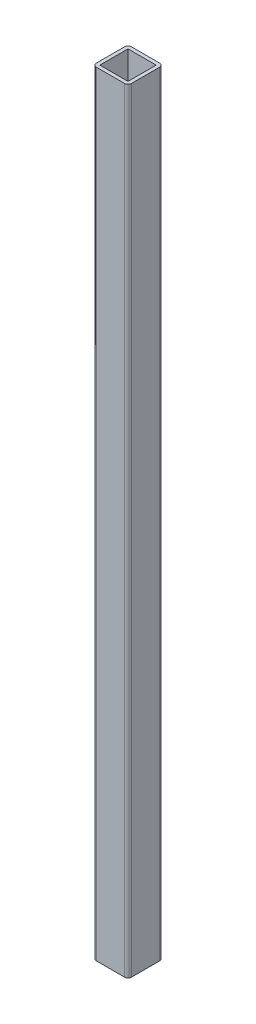
ISO-10303-21;
HEADER;
FILE_DESCRIPTION(('STEP AP214'),'2;1');
FILE_NAME('part.step','',(''),(''),'','','');
FILE_SCHEMA(('AUTOMOTIVE_DESIGN { 1 0 10303 214 1 1 1 1 }'));
ENDSEC;
DATA;
#1=APPLICATION_CONTEXT('core data for automotive mechanical design processes');
#2=APPLICATION_PROTOCOL_DEFINITION('international standard','automotive_design',2000,#1);
#3=PRODUCT_CONTEXT('',#1,'mechanical');
#4=PRODUCT('Part','Part','',(#3));
#5=PRODUCT_RELATED_PRODUCT_CATEGORY('part','',(#4));
#6=PRODUCT_DEFINITION_FORMATION('','',#4);
#7=PRODUCT_DEFINITION_CONTEXT('part definition',#1,'design');
#8=PRODUCT_DEFINITION('design','',#6,#7);
#9=PRODUCT_DEFINITION_SHAPE('','',#8);
#10=(LENGTH_UNIT() NAMED_UNIT(*) SI_UNIT(.MILLI.,.METRE.));
#11=(NAMED_UNIT(*) PLANE_ANGLE_UNIT() SI_UNIT($,.RADIAN.));
#12=(NAMED_UNIT(*) SI_UNIT($,.STERADIAN.) SOLID_ANGLE_UNIT());
#13=UNCERTAINTY_MEASURE_WITH_UNIT(LENGTH_MEASURE(1.E-05),#10,'distance_accuracy_value','');
#14=(GEOMETRIC_REPRESENTATION_CONTEXT(3) GLOBAL_UNCERTAINTY_ASSIGNED_CONTEXT((#13)) GLOBAL_UNIT_ASSIGNED_CONTEXT((#10,
#11,#12)) REPRESENTATION_CONTEXT('',''));
#15=CARTESIAN_POINT('',(0.,0.,0.));
#16=DIRECTION('',(0.,0.,1.));
#17=DIRECTION('',(1.,0.,0.));
#18=AXIS2_PLACEMENT_3D('',#15,#16,#17);
#19=CARTESIAN_POINT('',(12.7,558.8,-12.7));
#20=DIRECTION('',(0.,0.,1.));
#21=DIRECTION('',(1.,0.,0.));
#22=AXIS2_PLACEMENT_3D('',#19,#20,#21);
#23=PLANE('',#22);
#24=DIRECTION('',(-1.,0.,0.));
#25=VECTOR('',#24,1.);
#26=CARTESIAN_POINT('',(12.7,558.8,-12.7));
#27=LINE('',#26,#25);
#28=CARTESIAN_POINT('',(10.16,558.8,-12.7));
#29=VERTEX_POINT('',#28);
#30=CARTESIAN_POINT('',(-10.16,558.8,-12.7));
#31=VERTEX_POINT('',#30);
#32=EDGE_CURVE('E179',#29,#31,#27,.T.);
#33=ORIENTED_EDGE('',*,*,#32,.F.);
#34=DIRECTION('',(0.,-1.,0.));
#35=VECTOR('',#34,1.);
#36=CARTESIAN_POINT('',(10.16,0.,-12.7));
#37=LINE('',#36,#35);
#38=CARTESIAN_POINT('',(10.16,0.,-12.7));
#39=VERTEX_POINT('',#38);
#40=EDGE_CURVE('E11',#29,#39,#37,.T.);
#41=ORIENTED_EDGE('',*,*,#40,.T.);
#42=DIRECTION('',(-1.,0.,0.));
#43=VECTOR('',#42,1.);
#44=CARTESIAN_POINT('',(12.7,0.,-12.7));
#45=LINE('',#44,#43);
#46=CARTESIAN_POINT('',(-10.16,0.,-12.7));
#47=VERTEX_POINT('',#46);
#48=EDGE_CURVE('E196',#39,#47,#45,.T.);
#49=ORIENTED_EDGE('',*,*,#48,.T.);
#50=DIRECTION('',(0.,-1.,0.));
#51=VECTOR('',#50,1.);
#52=CARTESIAN_POINT('',(-10.16,558.8,-12.7));
#53=LINE('',#52,#51);
#54=EDGE_CURVE('E48',#47,#31,#53,.F.);
#55=ORIENTED_EDGE('',*,*,#54,.T.);
#56=EDGE_LOOP('',(#33,#41,#49,#55));
#57=FACE_BOUND('',#56,.T.);
#58=ADVANCED_FACE('F39',(#57),#23,.F.);
#59=CARTESIAN_POINT('',(-12.7,558.8,-12.7));
#60=DIRECTION('',(1.,0.,0.));
#61=DIRECTION('',(0.,0.,-1.));
#62=AXIS2_PLACEMENT_3D('',#59,#60,#61);
#63=PLANE('',#62);
#64=DIRECTION('',(0.,0.,1.));
#65=VECTOR('',#64,1.);
#66=CARTESIAN_POINT('',(-12.7,0.,-12.7));
#67=LINE('',#66,#65);
#68=CARTESIAN_POINT('',(-12.7,0.,-10.16));
#69=VERTEX_POINT('',#68);
#70=CARTESIAN_POINT('',(-12.7,0.,10.16));
#71=VERTEX_POINT('',#70);
#72=EDGE_CURVE('E200',#69,#71,#67,.T.);
#73=ORIENTED_EDGE('',*,*,#72,.T.);
#74=DIRECTION('',(0.,-1.,0.));
#75=VECTOR('',#74,1.);
#76=CARTESIAN_POINT('',(-12.7,558.8,10.16));
#77=LINE('',#76,#75);
#78=CARTESIAN_POINT('',(-12.7,558.8,10.16));
#79=VERTEX_POINT('',#78);
#80=EDGE_CURVE('E233',#71,#79,#77,.F.);
#81=ORIENTED_EDGE('',*,*,#80,.T.);
#82=DIRECTION('',(0.,0.,1.));
#83=VECTOR('',#82,1.);
#84=CARTESIAN_POINT('',(-12.7,558.8,-12.7));
#85=LINE('',#84,#83);
#86=CARTESIAN_POINT('',(-12.7,558.8,-10.16));
#87=VERTEX_POINT('',#86);
#88=EDGE_CURVE('E183',#87,#79,#85,.T.);
#89=ORIENTED_EDGE('',*,*,#88,.F.);
#90=DIRECTION('',(0.,-1.,0.));
#91=VECTOR('',#90,1.);
#92=CARTESIAN_POINT('',(-12.7,558.8,-10.16));
#93=LINE('',#92,#91);
#94=EDGE_CURVE('E229',#87,#69,#93,.T.);
#95=ORIENTED_EDGE('',*,*,#94,.T.);
#96=EDGE_LOOP('',(#73,#81,#89,#95));
#97=FACE_BOUND('',#96,.T.);
#98=ADVANCED_FACE('F266',(#97),#63,.F.);
#99=CARTESIAN_POINT('',(12.7,558.8,12.7));
#100=DIRECTION('',(0.,0.,1.));
#101=DIRECTION('',(1.,0.,0.));
#102=AXIS2_PLACEMENT_3D('',#99,#100,#101);
#103=PLANE('',#102);
#104=DIRECTION('',(-1.,0.,0.));
#105=VECTOR('',#104,1.);
#106=CARTESIAN_POINT('',(12.7,558.8,12.7));
#107=LINE('',#106,#105);
#108=CARTESIAN_POINT('',(10.16,558.8,12.7));
#109=VERTEX_POINT('',#108);
#110=CARTESIAN_POINT('',(-10.16,558.8,12.7));
#111=VERTEX_POINT('',#110);
#112=EDGE_CURVE('E188',#109,#111,#107,.T.);
#113=ORIENTED_EDGE('',*,*,#112,.T.);
#114=DIRECTION('',(0.,-1.,0.));
#115=VECTOR('',#114,1.);
#116=CARTESIAN_POINT('',(-10.16,0.,12.7));
#117=LINE('',#116,#115);
#118=CARTESIAN_POINT('',(-10.16,0.,12.7));
#119=VERTEX_POINT('',#118);
#120=EDGE_CURVE('E213',#111,#119,#117,.T.);
#121=ORIENTED_EDGE('',*,*,#120,.T.);
#122=DIRECTION('',(-1.,0.,0.));
#123=VECTOR('',#122,1.);
#124=CARTESIAN_POINT('',(12.7,0.,12.7));
#125=LINE('',#124,#123);
#126=CARTESIAN_POINT('',(10.16,0.,12.7));
#127=VERTEX_POINT('',#126);
#128=EDGE_CURVE('E204',#127,#119,#125,.T.);
#129=ORIENTED_EDGE('',*,*,#128,.F.);
#130=DIRECTION('',(0.,-1.,0.));
#131=VECTOR('',#130,1.);
#132=CARTESIAN_POINT('',(10.16,558.8,12.7));
#133=LINE('',#132,#131);
#134=EDGE_CURVE('E195',#127,#109,#133,.F.);
#135=ORIENTED_EDGE('',*,*,#134,.T.);
#136=EDGE_LOOP('',(#113,#121,#129,#135));
#137=FACE_BOUND('',#136,.T.);
#138=ADVANCED_FACE('F274',(#137),#103,.T.);
#139=CARTESIAN_POINT('',(12.7,558.8,-12.7));
#140=DIRECTION('',(1.,0.,0.));
#141=DIRECTION('',(0.,0.,-1.));
#142=AXIS2_PLACEMENT_3D('',#139,#140,#141);
#143=PLANE('',#142);
#144=DIRECTION('',(0.,0.,1.));
#145=VECTOR('',#144,1.);
#146=CARTESIAN_POINT('',(12.7,558.8,-12.7));
#147=LINE('',#146,#145);
#148=CARTESIAN_POINT('',(12.7,558.8,-10.16));
#149=VERTEX_POINT('',#148);
#150=CARTESIAN_POINT('',(12.7,558.8,10.16));
#151=VERTEX_POINT('',#150);
#152=EDGE_CURVE('E192',#149,#151,#147,.T.);
#153=ORIENTED_EDGE('',*,*,#152,.T.);
#154=DIRECTION('',(0.,-1.,0.));
#155=VECTOR('',#154,1.);
#156=CARTESIAN_POINT('',(12.7,558.8,10.16));
#157=LINE('',#156,#155);
#158=CARTESIAN_POINT('',(12.7,0.,10.16));
#159=VERTEX_POINT('',#158);
#160=EDGE_CURVE('E249',#151,#159,#157,.T.);
#161=ORIENTED_EDGE('',*,*,#160,.T.);
#162=DIRECTION('',(0.,0.,1.));
#163=VECTOR('',#162,1.);
#164=CARTESIAN_POINT('',(12.7,0.,-12.7));
#165=LINE('',#164,#163);
#166=CARTESIAN_POINT('',(12.7,0.,-10.16));
#167=VERTEX_POINT('',#166);
#168=EDGE_CURVE('E184',#167,#159,#165,.T.);
#169=ORIENTED_EDGE('',*,*,#168,.F.);
#170=DIRECTION('',(0.,-1.,0.));
#171=VECTOR('',#170,1.);
#172=CARTESIAN_POINT('',(12.7,558.8,-10.16));
#173=LINE('',#172,#171);
#174=EDGE_CURVE('E62',#167,#149,#173,.F.);
#175=ORIENTED_EDGE('',*,*,#174,.T.);
#176=EDGE_LOOP('',(#153,#161,#169,#175));
#177=FACE_BOUND('',#176,.T.);
#178=ADVANCED_FACE('F279',(#177),#143,.T.);
#179=CARTESIAN_POINT('',(0.,558.8,0.));
#180=DIRECTION('',(0.,1.,0.));
#181=DIRECTION('',(0.,0.,1.));
#182=AXIS2_PLACEMENT_3D('',#179,#180,#181);
#183=PLANE('',#182);
#184=DIRECTION('',(-1.,0.,0.));
#185=VECTOR('',#184,1.);
#186=CARTESIAN_POINT('',(12.7,558.8,-10.16));
#187=LINE('',#186,#185);
#188=CARTESIAN_POINT('',(10.16,558.8,-10.16));
#189=VERTEX_POINT('',#188);
#190=CARTESIAN_POINT('',(-10.16,558.8,-10.16));
#191=VERTEX_POINT('',#190);
#192=EDGE_CURVE('E160',#189,#191,#187,.T.);
#193=ORIENTED_EDGE('',*,*,#192,.F.);
#194=DIRECTION('',(0.,0.,1.));
#195=VECTOR('',#194,1.);
#196=CARTESIAN_POINT('',(10.16,558.8,-12.7));
#197=LINE('',#196,#195);
#198=CARTESIAN_POINT('',(10.16,558.8,10.16));
#199=VERTEX_POINT('',#198);
#200=EDGE_CURVE('E139',#189,#199,#197,.T.);
#201=ORIENTED_EDGE('',*,*,#200,.T.);
#202=DIRECTION('',(-1.,0.,0.));
#203=VECTOR('',#202,1.);
#204=CARTESIAN_POINT('',(12.7,558.8,10.16));
#205=LINE('',#204,#203);
#206=CARTESIAN_POINT('',(-10.16,558.8,10.16));
#207=VERTEX_POINT('',#206);
#208=EDGE_CURVE('E173',#199,#207,#205,.T.);
#209=ORIENTED_EDGE('',*,*,#208,.T.);
#210=DIRECTION('',(0.,0.,1.));
#211=VECTOR('',#210,1.);
#212=CARTESIAN_POINT('',(-10.16,558.8,-12.7));
#213=LINE('',#212,#211);
#214=EDGE_CURVE('E164',#191,#207,#213,.T.);
#215=ORIENTED_EDGE('',*,*,#214,.F.);
#216=EDGE_LOOP('',(#193,#201,#209,#215));
#217=FACE_BOUND('',#216,.T.);
#218=ORIENTED_EDGE('',*,*,#88,.T.);
#219=CARTESIAN_POINT('',(-10.16,558.8,10.16));
#220=DIRECTION('',(0.,1.,0.));
#221=DIRECTION('',(0.,0.,1.));
#222=AXIS2_PLACEMENT_3D('',#219,#220,#221);
#223=CIRCLE('',#222,2.54);
#224=EDGE_CURVE('E244',#79,#111,#223,.T.);
#225=ORIENTED_EDGE('',*,*,#224,.T.);
#226=ORIENTED_EDGE('',*,*,#112,.F.);
#227=CARTESIAN_POINT('',(10.16,558.8,10.16));
#228=DIRECTION('',(0.,1.,0.));
#229=DIRECTION('',(0.,0.,1.));
#230=AXIS2_PLACEMENT_3D('',#227,#228,#229);
#231=CIRCLE('',#230,2.54);
#232=EDGE_CURVE('E55',#109,#151,#231,.T.);
#233=ORIENTED_EDGE('',*,*,#232,.T.);
#234=ORIENTED_EDGE('',*,*,#152,.F.);
#235=CARTESIAN_POINT('',(10.16,558.8,-10.16));
#236=DIRECTION('',(0.,1.,0.));
#237=DIRECTION('',(0.,0.,1.));
#238=AXIS2_PLACEMENT_3D('',#235,#236,#237);
#239=CIRCLE('',#238,2.54);
#240=EDGE_CURVE('E239',#149,#29,#239,.T.);
#241=ORIENTED_EDGE('',*,*,#240,.T.);
#242=ORIENTED_EDGE('',*,*,#32,.T.);
#243=CARTESIAN_POINT('',(-10.16,558.8,-10.16));
#244=DIRECTION('',(0.,1.,0.));
#245=DIRECTION('',(0.,0.,1.));
#246=AXIS2_PLACEMENT_3D('',#243,#244,#245);
#247=CIRCLE('',#246,2.54);
#248=EDGE_CURVE('E236',#31,#87,#247,.T.);
#249=ORIENTED_EDGE('',*,*,#248,.T.);
#250=EDGE_LOOP('',(#218,#225,#226,#233,#234,#241,#242,#249));
#251=FACE_BOUND('',#250,.T.);
#252=ADVANCED_FACE('F260',(#217,#251),#183,.T.);
#253=CARTESIAN_POINT('',(0.,0.,0.));
#254=DIRECTION('',(0.,1.,0.));
#255=DIRECTION('',(0.,0.,1.));
#256=AXIS2_PLACEMENT_3D('',#253,#254,#255);
#257=PLANE('',#256);
#258=DIRECTION('',(0.,0.,1.));
#259=VECTOR('',#258,1.);
#260=CARTESIAN_POINT('',(10.16,0.,-12.7));
#261=LINE('',#260,#259);
#262=CARTESIAN_POINT('',(10.16,0.,-10.16));
#263=VERTEX_POINT('',#262);
#264=CARTESIAN_POINT('',(10.16,0.,10.16));
#265=VERTEX_POINT('',#264);
#266=EDGE_CURVE('E136',#263,#265,#261,.T.);
#267=ORIENTED_EDGE('',*,*,#266,.F.);
#268=DIRECTION('',(-1.,0.,0.));
#269=VECTOR('',#268,1.);
#270=CARTESIAN_POINT('',(12.7,0.,-10.16));
#271=LINE('',#270,#269);
#272=CARTESIAN_POINT('',(-10.16,0.,-10.16));
#273=VERTEX_POINT('',#272);
#274=EDGE_CURVE('E147',#263,#273,#271,.T.);
#275=ORIENTED_EDGE('',*,*,#274,.T.);
#276=DIRECTION('',(0.,0.,1.));
#277=VECTOR('',#276,1.);
#278=CARTESIAN_POINT('',(-10.16,0.,-12.7));
#279=LINE('',#278,#277);
#280=CARTESIAN_POINT('',(-10.16,0.,10.16));
#281=VERTEX_POINT('',#280);
#282=EDGE_CURVE('E154',#273,#281,#279,.T.);
#283=ORIENTED_EDGE('',*,*,#282,.T.);
#284=DIRECTION('',(-1.,0.,0.));
#285=VECTOR('',#284,1.);
#286=CARTESIAN_POINT('',(12.7,0.,10.16));
#287=LINE('',#286,#285);
#288=EDGE_CURVE('E158',#265,#281,#287,.T.);
#289=ORIENTED_EDGE('',*,*,#288,.F.);
#290=EDGE_LOOP('',(#267,#275,#283,#289));
#291=FACE_BOUND('',#290,.T.);
#292=ORIENTED_EDGE('',*,*,#128,.T.);
#293=CARTESIAN_POINT('',(-10.16,0.,10.16));
#294=DIRECTION('',(0.,1.,0.));
#295=DIRECTION('',(0.,0.,1.));
#296=AXIS2_PLACEMENT_3D('',#293,#294,#295);
#297=CIRCLE('',#296,2.54);
#298=EDGE_CURVE('E226',#119,#71,#297,.F.);
#299=ORIENTED_EDGE('',*,*,#298,.T.);
#300=ORIENTED_EDGE('',*,*,#72,.F.);
#301=CARTESIAN_POINT('',(-10.16,0.,-10.16));
#302=DIRECTION('',(0.,1.,0.));
#303=DIRECTION('',(0.,0.,1.));
#304=AXIS2_PLACEMENT_3D('',#301,#302,#303);
#305=CIRCLE('',#304,2.54);
#306=EDGE_CURVE('E217',#69,#47,#305,.F.);
#307=ORIENTED_EDGE('',*,*,#306,.T.);
#308=ORIENTED_EDGE('',*,*,#48,.F.);
#309=CARTESIAN_POINT('',(10.16,0.,-10.16));
#310=DIRECTION('',(0.,1.,0.));
#311=DIRECTION('',(0.,0.,1.));
#312=AXIS2_PLACEMENT_3D('',#309,#310,#311);
#313=CIRCLE('',#312,2.54);
#314=EDGE_CURVE('E220',#39,#167,#313,.F.);
#315=ORIENTED_EDGE('',*,*,#314,.T.);
#316=ORIENTED_EDGE('',*,*,#168,.T.);
#317=CARTESIAN_POINT('',(10.16,0.,10.16));
#318=DIRECTION('',(0.,1.,0.));
#319=DIRECTION('',(0.,0.,1.));
#320=AXIS2_PLACEMENT_3D('',#317,#318,#319);
#321=CIRCLE('',#320,2.54);
#322=EDGE_CURVE('E223',#159,#127,#321,.F.);
#323=ORIENTED_EDGE('',*,*,#322,.T.);
#324=EDGE_LOOP('',(#292,#299,#300,#307,#308,#315,#316,#323));
#325=FACE_BOUND('',#324,.T.);
#326=ADVANCED_FACE('F156',(#291,#325),#257,.F.);
#327=CARTESIAN_POINT('',(12.7,558.8,-10.16));
#328=DIRECTION('',(0.,0.,1.));
#329=DIRECTION('',(1.,0.,0.));
#330=AXIS2_PLACEMENT_3D('',#327,#328,#329);
#331=PLANE('',#330);
#332=ORIENTED_EDGE('',*,*,#274,.F.);
#333=DIRECTION('',(0.,-1.,0.));
#334=VECTOR('',#333,1.);
#335=CARTESIAN_POINT('',(10.16,558.8,-10.16));
#336=LINE('',#335,#334);
#337=EDGE_CURVE('E131',#189,#263,#336,.T.);
#338=ORIENTED_EDGE('',*,*,#337,.F.);
#339=ORIENTED_EDGE('',*,*,#192,.T.);
#340=DIRECTION('',(0.,-1.,0.));
#341=VECTOR('',#340,1.);
#342=CARTESIAN_POINT('',(-10.16,558.8,-10.16));
#343=LINE('',#342,#341);
#344=EDGE_CURVE('E150',#191,#273,#343,.T.);
#345=ORIENTED_EDGE('',*,*,#344,.T.);
#346=EDGE_LOOP('',(#332,#338,#339,#345));
#347=FACE_BOUND('',#346,.T.);
#348=ADVANCED_FACE('F148',(#347),#331,.T.);
#349=CARTESIAN_POINT('',(-10.16,558.8,-12.7));
#350=DIRECTION('',(1.,0.,0.));
#351=DIRECTION('',(0.,0.,-1.));
#352=AXIS2_PLACEMENT_3D('',#349,#350,#351);
#353=PLANE('',#352);
#354=ORIENTED_EDGE('',*,*,#282,.F.);
#355=ORIENTED_EDGE('',*,*,#344,.F.);
#356=ORIENTED_EDGE('',*,*,#214,.T.);
#357=DIRECTION('',(0.,-1.,0.));
#358=VECTOR('',#357,1.);
#359=CARTESIAN_POINT('',(-10.16,558.8,10.16));
#360=LINE('',#359,#358);
#361=EDGE_CURVE('E400',#207,#281,#360,.T.);
#362=ORIENTED_EDGE('',*,*,#361,.T.);
#363=EDGE_LOOP('',(#354,#355,#356,#362));
#364=FACE_BOUND('',#363,.T.);
#365=ADVANCED_FACE('F305',(#364),#353,.T.);
#366=CARTESIAN_POINT('',(12.7,558.8,10.16));
#367=DIRECTION('',(0.,0.,1.));
#368=DIRECTION('',(1.,0.,0.));
#369=AXIS2_PLACEMENT_3D('',#366,#367,#368);
#370=PLANE('',#369);
#371=ORIENTED_EDGE('',*,*,#288,.T.);
#372=ORIENTED_EDGE('',*,*,#361,.F.);
#373=ORIENTED_EDGE('',*,*,#208,.F.);
#374=DIRECTION('',(0.,-1.,0.));
#375=VECTOR('',#374,1.);
#376=CARTESIAN_POINT('',(10.16,558.8,10.16));
#377=LINE('',#376,#375);
#378=EDGE_CURVE('E143',#199,#265,#377,.T.);
#379=ORIENTED_EDGE('',*,*,#378,.T.);
#380=EDGE_LOOP('',(#371,#372,#373,#379));
#381=FACE_BOUND('',#380,.T.);
#382=ADVANCED_FACE('F300',(#381),#370,.F.);
#383=CARTESIAN_POINT('',(10.16,558.8,-12.7));
#384=DIRECTION('',(1.,0.,0.));
#385=DIRECTION('',(0.,0.,-1.));
#386=AXIS2_PLACEMENT_3D('',#383,#384,#385);
#387=PLANE('',#386);
#388=ORIENTED_EDGE('',*,*,#266,.T.);
#389=ORIENTED_EDGE('',*,*,#378,.F.);
#390=ORIENTED_EDGE('',*,*,#200,.F.);
#391=ORIENTED_EDGE('',*,*,#337,.T.);
#392=EDGE_LOOP('',(#388,#389,#390,#391));
#393=FACE_BOUND('',#392,.T.);
#394=ADVANCED_FACE('F133',(#393),#387,.F.);
#395=CARTESIAN_POINT('',(-10.16,558.8,10.16));
#396=DIRECTION('',(0.,1.,0.));
#397=DIRECTION('',(0.,0.,1.));
#398=AXIS2_PLACEMENT_3D('',#395,#396,#397);
#399=CYLINDRICAL_SURFACE('',#398,2.54);
#400=ORIENTED_EDGE('',*,*,#224,.F.);
#401=ORIENTED_EDGE('',*,*,#80,.F.);
#402=ORIENTED_EDGE('',*,*,#298,.F.);
#403=ORIENTED_EDGE('',*,*,#120,.F.);
#404=EDGE_LOOP('',(#400,#401,#402,#403));
#405=FACE_BOUND('',#404,.T.);
#406=ADVANCED_FACE('F272',(#405),#399,.T.);
#407=CARTESIAN_POINT('',(10.16,558.8,10.16));
#408=DIRECTION('',(0.,-1.,0.));
#409=DIRECTION('',(0.,0.,-1.));
#410=AXIS2_PLACEMENT_3D('',#407,#408,#409);
#411=CYLINDRICAL_SURFACE('',#410,2.54);
#412=ORIENTED_EDGE('',*,*,#232,.F.);
#413=ORIENTED_EDGE('',*,*,#134,.F.);
#414=ORIENTED_EDGE('',*,*,#322,.F.);
#415=ORIENTED_EDGE('',*,*,#160,.F.);
#416=EDGE_LOOP('',(#412,#413,#414,#415));
#417=FACE_BOUND('',#416,.T.);
#418=ADVANCED_FACE('F278',(#417),#411,.T.);
#419=CARTESIAN_POINT('',(10.16,558.8,-10.16));
#420=DIRECTION('',(0.,1.,0.));
#421=DIRECTION('',(0.,0.,1.));
#422=AXIS2_PLACEMENT_3D('',#419,#420,#421);
#423=CYLINDRICAL_SURFACE('',#422,2.54);
#424=ORIENTED_EDGE('',*,*,#240,.F.);
#425=ORIENTED_EDGE('',*,*,#174,.F.);
#426=ORIENTED_EDGE('',*,*,#314,.F.);
#427=ORIENTED_EDGE('',*,*,#40,.F.);
#428=EDGE_LOOP('',(#424,#425,#426,#427));
#429=FACE_BOUND('',#428,.T.);
#430=ADVANCED_FACE('F281',(#429),#423,.T.);
#431=CARTESIAN_POINT('',(-10.16,558.8,-10.16));
#432=DIRECTION('',(0.,-1.,0.));
#433=DIRECTION('',(0.,0.,-1.));
#434=AXIS2_PLACEMENT_3D('',#431,#432,#433);
#435=CYLINDRICAL_SURFACE('',#434,2.54);
#436=ORIENTED_EDGE('',*,*,#248,.F.);
#437=ORIENTED_EDGE('',*,*,#54,.F.);
#438=ORIENTED_EDGE('',*,*,#306,.F.);
#439=ORIENTED_EDGE('',*,*,#94,.F.);
#440=EDGE_LOOP('',(#436,#437,#438,#439));
#441=FACE_BOUND('',#440,.T.);
#442=ADVANCED_FACE('F41',(#441),#435,.T.);
#443=CLOSED_SHELL('',(#58,#98,#138,#178,#252,#326,#348,#365,#382,#394,#406,#418,#430,#442));
#444=MANIFOLD_SOLID_BREP('B2',#443);
#445=ADVANCED_BREP_SHAPE_REPRESENTATION('',(#18,#444),#14);
#446=SHAPE_DEFINITION_REPRESENTATION(#9,#445);
ENDSEC;
END-ISO-10303-21;
